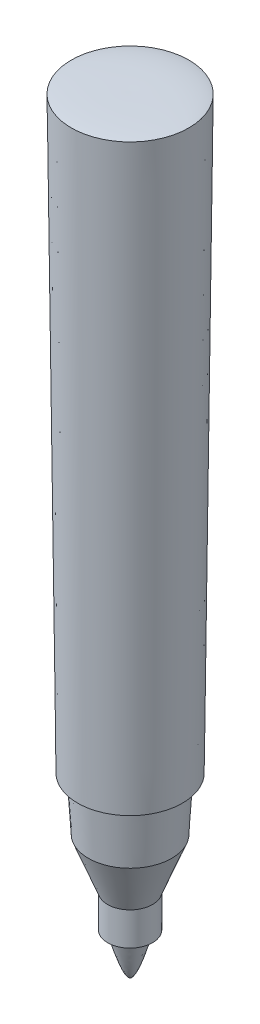
ISO-10303-21;
HEADER;
FILE_DESCRIPTION(('STEP AP214'),'2;1');
FILE_NAME('part.step','',(''),(''),'','','');
FILE_SCHEMA(('AUTOMOTIVE_DESIGN { 1 0 10303 214 1 1 1 1 }'));
ENDSEC;
DATA;
#1=APPLICATION_CONTEXT('core data for automotive mechanical design processes');
#2=APPLICATION_PROTOCOL_DEFINITION('international standard','automotive_design',2000,#1);
#3=PRODUCT_CONTEXT('',#1,'mechanical');
#4=PRODUCT('Part','Part','',(#3));
#5=PRODUCT_RELATED_PRODUCT_CATEGORY('part','',(#4));
#6=PRODUCT_DEFINITION_FORMATION('','',#4);
#7=PRODUCT_DEFINITION_CONTEXT('part definition',#1,'design');
#8=PRODUCT_DEFINITION('design','',#6,#7);
#9=PRODUCT_DEFINITION_SHAPE('','',#8);
#10=(LENGTH_UNIT() NAMED_UNIT(*) SI_UNIT(.MILLI.,.METRE.));
#11=(NAMED_UNIT(*) PLANE_ANGLE_UNIT() SI_UNIT($,.RADIAN.));
#12=(NAMED_UNIT(*) SI_UNIT($,.STERADIAN.) SOLID_ANGLE_UNIT());
#13=UNCERTAINTY_MEASURE_WITH_UNIT(LENGTH_MEASURE(1.E-05),#10,'distance_accuracy_value','');
#14=(GEOMETRIC_REPRESENTATION_CONTEXT(3) GLOBAL_UNCERTAINTY_ASSIGNED_CONTEXT((#13)) GLOBAL_UNIT_ASSIGNED_CONTEXT((#10,
#11,#12)) REPRESENTATION_CONTEXT('',''));
#15=CARTESIAN_POINT('',(0.,0.,0.));
#16=DIRECTION('',(0.,0.,1.));
#17=DIRECTION('',(1.,0.,0.));
#18=AXIS2_PLACEMENT_3D('',#15,#16,#17);
#19=CARTESIAN_POINT('',(0.,0.,0.));
#20=CARTESIAN_POINT('',(0.934954865100335,0.0329497410632446,0.));
#21=CARTESIAN_POINT('',(2.8,7.,0.));
#22=B_SPLINE_CURVE_WITH_KNOTS('',2,(#19,#20,#21),.UNSPECIFIED.,.F.,.F.,(3,3),(0.,1.),.UNSPECIFIED.);
#23=CARTESIAN_POINT('',(0.,0.,0.));
#24=DIRECTION('',(0.,-1.,0.));
#25=AXIS1_PLACEMENT('',#23,#24);
#26=SURFACE_OF_REVOLUTION('',#22,#25);
#27=CARTESIAN_POINT('',(0.,7.,0.));
#28=DIRECTION('',(0.,-1.,0.));
#29=DIRECTION('',(0.,0.,-1.));
#30=AXIS2_PLACEMENT_3D('',#27,#28,#29);
#31=CIRCLE('',#30,2.8);
#32=CARTESIAN_POINT('',(0.,7.,-2.8));
#33=VERTEX_POINT('',#32);
#34=EDGE_CURVE('E87',#33,#33,#31,.T.);
#35=ORIENTED_EDGE('',*,*,#34,.T.);
#36=EDGE_LOOP('',(#35));
#37=FACE_BOUND('',#36,.T.);
#38=CARTESIAN_POINT('',(0.,0.,0.));
#39=VERTEX_POINT('',#38);
#40=VERTEX_LOOP('',#39);
#41=FACE_BOUND('',#40,.T.);
#42=ADVANCED_FACE('F41',(#37,#41),#26,.F.);
#43=CARTESIAN_POINT('',(9.95,129.5,0.));
#44=CARTESIAN_POINT('',(7.44471687848869,130.087394751362,0.));
#45=CARTESIAN_POINT('',(0.,130.,0.));
#46=B_SPLINE_CURVE_WITH_KNOTS('',2,(#43,#44,#45),.UNSPECIFIED.,.F.,.F.,(3,3),(0.,1.),.UNSPECIFIED.);
#47=CARTESIAN_POINT('',(0.,0.,0.));
#48=DIRECTION('',(0.,-1.,0.));
#49=AXIS1_PLACEMENT('',#47,#48);
#50=SURFACE_OF_REVOLUTION('',#46,#49);
#51=CARTESIAN_POINT('',(0.,130.,0.));
#52=VERTEX_POINT('',#51);
#53=VERTEX_LOOP('',#52);
#54=FACE_BOUND('',#53,.T.);
#55=CARTESIAN_POINT('',(0.,129.5,0.));
#56=DIRECTION('',(0.,-1.,0.));
#57=DIRECTION('',(0.,0.,-1.));
#58=AXIS2_PLACEMENT_3D('',#55,#56,#57);
#59=CIRCLE('',#58,9.95);
#60=CARTESIAN_POINT('',(0.,129.5,-9.95));
#61=VERTEX_POINT('',#60);
#62=EDGE_CURVE('E11',#61,#61,#59,.T.);
#63=ORIENTED_EDGE('',*,*,#62,.F.);
#64=EDGE_LOOP('',(#63));
#65=FACE_BOUND('',#64,.T.);
#66=ADVANCED_FACE('F56',(#54,#65),#50,.F.);
#67=CARTESIAN_POINT('',(0.,30.,0.));
#68=DIRECTION('',(0.,1.,0.));
#69=DIRECTION('',(0.,0.,1.));
#70=AXIS2_PLACEMENT_3D('',#67,#68,#69);
#71=CONICAL_SURFACE('',#70,8.875,0.0108035997568623);
#72=ORIENTED_EDGE('',*,*,#62,.T.);
#73=EDGE_LOOP('',(#72));
#74=FACE_BOUND('',#73,.T.);
#75=CARTESIAN_POINT('',(0.,30.,0.));
#76=DIRECTION('',(0.,-1.,0.));
#77=DIRECTION('',(0.,0.,-1.));
#78=AXIS2_PLACEMENT_3D('',#75,#76,#77);
#79=CIRCLE('',#78,8.875);
#80=CARTESIAN_POINT('',(0.,30.,-8.875));
#81=VERTEX_POINT('',#80);
#82=EDGE_CURVE('E50',#81,#81,#79,.T.);
#83=ORIENTED_EDGE('',*,*,#82,.F.);
#84=EDGE_LOOP('',(#83));
#85=FACE_BOUND('',#84,.T.);
#86=ADVANCED_FACE('F59',(#74,#85),#71,.T.);
#87=CARTESIAN_POINT('',(7.6,30.,0.));
#88=DIRECTION('',(0.,-1.,0.));
#89=DIRECTION('',(0.,0.,-1.));
#90=AXIS2_PLACEMENT_3D('',#87,#88,#89);
#91=PLANE('',#90);
#92=ORIENTED_EDGE('',*,*,#82,.T.);
#93=EDGE_LOOP('',(#92));
#94=FACE_BOUND('',#93,.T.);
#95=CARTESIAN_POINT('',(0.,30.,0.));
#96=DIRECTION('',(0.,-1.,0.));
#97=DIRECTION('',(0.,0.,-1.));
#98=AXIS2_PLACEMENT_3D('',#95,#96,#97);
#99=CIRCLE('',#98,7.6);
#100=CARTESIAN_POINT('',(0.,30.,-7.6));
#101=VERTEX_POINT('',#100);
#102=EDGE_CURVE('E70',#101,#101,#99,.T.);
#103=ORIENTED_EDGE('',*,*,#102,.F.);
#104=EDGE_LOOP('',(#103));
#105=FACE_BOUND('',#104,.T.);
#106=ADVANCED_FACE('F64',(#94,#105),#91,.T.);
#107=CARTESIAN_POINT('',(0.,21.,0.));
#108=DIRECTION('',(0.,1.,0.));
#109=DIRECTION('',(0.,0.,1.));
#110=AXIS2_PLACEMENT_3D('',#107,#108,#109);
#111=CONICAL_SURFACE('',#110,7.05,0.061035206589689);
#112=ORIENTED_EDGE('',*,*,#102,.T.);
#113=EDGE_LOOP('',(#112));
#114=FACE_BOUND('',#113,.T.);
#115=CARTESIAN_POINT('',(0.,21.,0.));
#116=DIRECTION('',(0.,-1.,0.));
#117=DIRECTION('',(0.,0.,-1.));
#118=AXIS2_PLACEMENT_3D('',#115,#116,#117);
#119=CIRCLE('',#118,7.05);
#120=CARTESIAN_POINT('',(0.,21.,-7.05));
#121=VERTEX_POINT('',#120);
#122=EDGE_CURVE('E73',#121,#121,#119,.T.);
#123=ORIENTED_EDGE('',*,*,#122,.F.);
#124=EDGE_LOOP('',(#123));
#125=FACE_BOUND('',#124,.T.);
#126=ADVANCED_FACE('F103',(#114,#125),#111,.T.);
#127=CARTESIAN_POINT('',(0.,12.6,0.));
#128=DIRECTION('',(0.,1.,0.));
#129=DIRECTION('',(0.,0.,1.));
#130=AXIS2_PLACEMENT_3D('',#127,#128,#129);
#131=CONICAL_SURFACE('',#130,3.8,0.369166657007176);
#132=ORIENTED_EDGE('',*,*,#122,.T.);
#133=EDGE_LOOP('',(#132));
#134=FACE_BOUND('',#133,.T.);
#135=CARTESIAN_POINT('',(0.,12.6,0.));
#136=DIRECTION('',(0.,-1.,0.));
#137=DIRECTION('',(0.,0.,-1.));
#138=AXIS2_PLACEMENT_3D('',#135,#136,#137);
#139=CIRCLE('',#138,3.8);
#140=CARTESIAN_POINT('',(0.,12.6,-3.8));
#141=VERTEX_POINT('',#140);
#142=EDGE_CURVE('E79',#141,#141,#139,.T.);
#143=ORIENTED_EDGE('',*,*,#142,.F.);
#144=EDGE_LOOP('',(#143));
#145=FACE_BOUND('',#144,.T.);
#146=ADVANCED_FACE('F106',(#134,#145),#131,.T.);
#147=CARTESIAN_POINT('',(0.,0.,0.));
#148=DIRECTION('',(0.,-1.,0.));
#149=DIRECTION('',(0.,0.,-1.));
#150=AXIS2_PLACEMENT_3D('',#147,#148,#149);
#151=CYLINDRICAL_SURFACE('',#150,3.8);
#152=ORIENTED_EDGE('',*,*,#142,.T.);
#153=EDGE_LOOP('',(#152));
#154=FACE_BOUND('',#153,.T.);
#155=CARTESIAN_POINT('',(0.,7.,0.));
#156=DIRECTION('',(0.,-1.,0.));
#157=DIRECTION('',(0.,0.,-1.));
#158=AXIS2_PLACEMENT_3D('',#155,#156,#157);
#159=CIRCLE('',#158,3.8);
#160=CARTESIAN_POINT('',(0.,7.,-3.8));
#161=VERTEX_POINT('',#160);
#162=EDGE_CURVE('E83',#161,#161,#159,.T.);
#163=ORIENTED_EDGE('',*,*,#162,.F.);
#164=EDGE_LOOP('',(#163));
#165=FACE_BOUND('',#164,.T.);
#166=ADVANCED_FACE('F110',(#154,#165),#151,.T.);
#167=CARTESIAN_POINT('',(3.8,7.,0.));
#168=DIRECTION('',(0.,-1.,0.));
#169=DIRECTION('',(0.,0.,-1.));
#170=AXIS2_PLACEMENT_3D('',#167,#168,#169);
#171=PLANE('',#170);
#172=ORIENTED_EDGE('',*,*,#162,.T.);
#173=EDGE_LOOP('',(#172));
#174=FACE_BOUND('',#173,.T.);
#175=ORIENTED_EDGE('',*,*,#34,.F.);
#176=EDGE_LOOP('',(#175));
#177=FACE_BOUND('',#176,.T.);
#178=ADVANCED_FACE('F114',(#174,#177),#171,.T.);
#179=CLOSED_SHELL('',(#42,#66,#86,#106,#126,#146,#166,#178));
#180=MANIFOLD_SOLID_BREP('B2',#179);
#181=ADVANCED_BREP_SHAPE_REPRESENTATION('',(#18,#180),#14);
#182=SHAPE_DEFINITION_REPRESENTATION(#9,#181);
ENDSEC;
END-ISO-10303-21;
